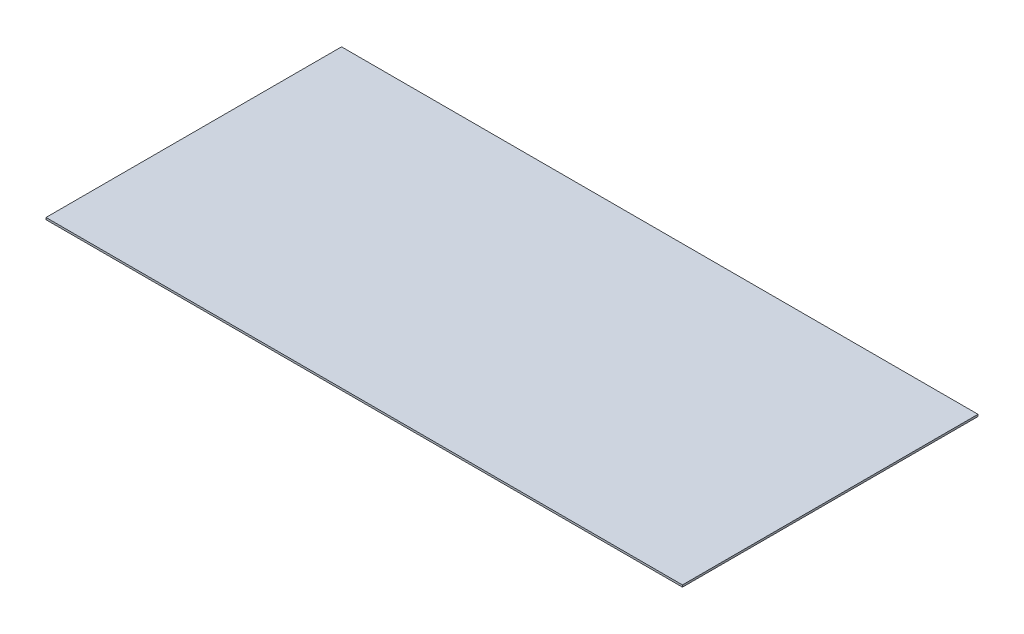
ISO-10303-21;
HEADER;
FILE_DESCRIPTION(('STEP AP214'),'2;1');
FILE_NAME('part.step','',(''),(''),'','','');
FILE_SCHEMA(('AUTOMOTIVE_DESIGN { 1 0 10303 214 1 1 1 1 }'));
ENDSEC;
DATA;
#1=APPLICATION_CONTEXT('core data for automotive mechanical design processes');
#2=APPLICATION_PROTOCOL_DEFINITION('international standard','automotive_design',2000,#1);
#3=PRODUCT_CONTEXT('',#1,'mechanical');
#4=PRODUCT('Part','Part','',(#3));
#5=PRODUCT_RELATED_PRODUCT_CATEGORY('part','',(#4));
#6=PRODUCT_DEFINITION_FORMATION('','',#4);
#7=PRODUCT_DEFINITION_CONTEXT('part definition',#1,'design');
#8=PRODUCT_DEFINITION('design','',#6,#7);
#9=PRODUCT_DEFINITION_SHAPE('','',#8);
#10=(LENGTH_UNIT() NAMED_UNIT(*) SI_UNIT(.MILLI.,.METRE.));
#11=(NAMED_UNIT(*) PLANE_ANGLE_UNIT() SI_UNIT($,.RADIAN.));
#12=(NAMED_UNIT(*) SI_UNIT($,.STERADIAN.) SOLID_ANGLE_UNIT());
#13=UNCERTAINTY_MEASURE_WITH_UNIT(LENGTH_MEASURE(1.E-05),#10,'distance_accuracy_value','');
#14=(GEOMETRIC_REPRESENTATION_CONTEXT(3) GLOBAL_UNCERTAINTY_ASSIGNED_CONTEXT((#13)) GLOBAL_UNIT_ASSIGNED_CONTEXT((#10,
#11,#12)) REPRESENTATION_CONTEXT('',''));
#15=CARTESIAN_POINT('',(0.,0.,0.));
#16=DIRECTION('',(0.,0.,1.));
#17=DIRECTION('',(1.,0.,0.));
#18=AXIS2_PLACEMENT_3D('',#15,#16,#17);
#19=CARTESIAN_POINT('',(0.,-2.5,0.));
#20=DIRECTION('',(0.,-1.,0.));
#21=DIRECTION('',(0.,0.,-1.));
#22=AXIS2_PLACEMENT_3D('',#19,#20,#21);
#23=PLANE('',#22);
#24=DIRECTION('',(0.,0.,-1.));
#25=VECTOR('',#24,1.);
#26=CARTESIAN_POINT('',(806.100000000001,-2.49999999999995,374.299999999981));
#27=LINE('',#26,#25);
#28=CARTESIAN_POINT('',(806.100000000001,-2.49999999999995,374.299999999981));
#29=VERTEX_POINT('',#28);
#30=CARTESIAN_POINT('',(806.100000000001,-2.49999999999995,-374.299999999964));
#31=VERTEX_POINT('',#30);
#32=EDGE_CURVE('E95',#29,#31,#27,.T.);
#33=ORIENTED_EDGE('',*,*,#32,.F.);
#34=DIRECTION('',(1.,0.,0.));
#35=VECTOR('',#34,1.);
#36=CARTESIAN_POINT('',(806.100000000001,-2.49999999999995,374.299999999981));
#37=LINE('',#36,#35);
#38=CARTESIAN_POINT('',(-806.099999999999,-2.49999999999995,374.299999999981));
#39=VERTEX_POINT('',#38);
#40=EDGE_CURVE('E87',#39,#29,#37,.T.);
#41=ORIENTED_EDGE('',*,*,#40,.F.);
#42=DIRECTION('',(0.,0.,1.));
#43=VECTOR('',#42,1.);
#44=CARTESIAN_POINT('',(-806.099999999999,-2.49999999999995,374.299999999981));
#45=LINE('',#44,#43);
#46=CARTESIAN_POINT('',(-806.099999999999,-2.49999999999995,-374.299999999964));
#47=VERTEX_POINT('',#46);
#48=EDGE_CURVE('E73',#47,#39,#45,.T.);
#49=ORIENTED_EDGE('',*,*,#48,.F.);
#50=DIRECTION('',(-1.,0.,0.));
#51=VECTOR('',#50,1.);
#52=CARTESIAN_POINT('',(806.100000000001,-2.49999999999995,-374.299999999964));
#53=LINE('',#52,#51);
#54=EDGE_CURVE('E84',#31,#47,#53,.T.);
#55=ORIENTED_EDGE('',*,*,#54,.F.);
#56=EDGE_LOOP('',(#33,#41,#49,#55));
#57=FACE_BOUND('',#56,.T.);
#58=ADVANCED_FACE('F33',(#57),#23,.T.);
#59=CARTESIAN_POINT('',(806.100000000001,1780.02378324452,374.299999999981));
#60=DIRECTION('',(-1.,0.,0.));
#61=DIRECTION('',(0.,0.,1.));
#62=AXIS2_PLACEMENT_3D('',#59,#60,#61);
#63=PLANE('',#62);
#64=DIRECTION('',(0.,-1.,0.));
#65=VECTOR('',#64,1.);
#66=CARTESIAN_POINT('',(806.100000000001,1780.02378324452,-374.299999999964));
#67=LINE('',#66,#65);
#68=CARTESIAN_POINT('',(806.100000000001,2.49999999999995,-374.299999999964));
#69=VERTEX_POINT('',#68);
#70=EDGE_CURVE('E90',#69,#31,#67,.T.);
#71=ORIENTED_EDGE('',*,*,#70,.F.);
#72=DIRECTION('',(0.,0.,1.));
#73=VECTOR('',#72,1.);
#74=CARTESIAN_POINT('',(806.100000000001,2.49999999999995,374.299999999981));
#75=LINE('',#74,#73);
#76=CARTESIAN_POINT('',(806.100000000001,2.49999999999995,374.299999999981));
#77=VERTEX_POINT('',#76);
#78=EDGE_CURVE('E49',#69,#77,#75,.T.);
#79=ORIENTED_EDGE('',*,*,#78,.T.);
#80=DIRECTION('',(0.,-1.,0.));
#81=VECTOR('',#80,1.);
#82=CARTESIAN_POINT('',(806.100000000001,1780.02378324452,374.299999999981));
#83=LINE('',#82,#81);
#84=EDGE_CURVE('E92',#77,#29,#83,.T.);
#85=ORIENTED_EDGE('',*,*,#84,.T.);
#86=ORIENTED_EDGE('',*,*,#32,.T.);
#87=EDGE_LOOP('',(#71,#79,#85,#86));
#88=FACE_BOUND('',#87,.T.);
#89=ADVANCED_FACE('F107',(#88),#63,.F.);
#90=CARTESIAN_POINT('',(806.100000000001,1780.02378324452,-374.299999999964));
#91=DIRECTION('',(0.,0.,1.));
#92=DIRECTION('',(1.,0.,0.));
#93=AXIS2_PLACEMENT_3D('',#90,#91,#92);
#94=PLANE('',#93);
#95=DIRECTION('',(0.,-1.,0.));
#96=VECTOR('',#95,1.);
#97=CARTESIAN_POINT('',(-806.099999999999,1780.02378324452,-374.299999999964));
#98=LINE('',#97,#96);
#99=CARTESIAN_POINT('',(-806.099999999999,2.49999999999995,-374.299999999964));
#100=VERTEX_POINT('',#99);
#101=EDGE_CURVE('E69',#100,#47,#98,.T.);
#102=ORIENTED_EDGE('',*,*,#101,.F.);
#103=DIRECTION('',(1.,0.,0.));
#104=VECTOR('',#103,1.);
#105=CARTESIAN_POINT('',(806.100000000001,2.49999999999995,-374.299999999964));
#106=LINE('',#105,#104);
#107=EDGE_CURVE('E98',#100,#69,#106,.T.);
#108=ORIENTED_EDGE('',*,*,#107,.T.);
#109=ORIENTED_EDGE('',*,*,#70,.T.);
#110=ORIENTED_EDGE('',*,*,#54,.T.);
#111=EDGE_LOOP('',(#102,#108,#109,#110));
#112=FACE_BOUND('',#111,.T.);
#113=ADVANCED_FACE('F89',(#112),#94,.F.);
#114=CARTESIAN_POINT('',(-806.099999999999,1780.02378324452,374.299999999981));
#115=DIRECTION('',(1.,0.,0.));
#116=DIRECTION('',(0.,0.,-1.));
#117=AXIS2_PLACEMENT_3D('',#114,#115,#116);
#118=PLANE('',#117);
#119=DIRECTION('',(0.,-1.,0.));
#120=VECTOR('',#119,1.);
#121=CARTESIAN_POINT('',(-806.099999999999,1780.02378324452,374.299999999981));
#122=LINE('',#121,#120);
#123=CARTESIAN_POINT('',(-806.099999999999,2.49999999999995,374.299999999981));
#124=VERTEX_POINT('',#123);
#125=EDGE_CURVE('E11',#124,#39,#122,.T.);
#126=ORIENTED_EDGE('',*,*,#125,.F.);
#127=DIRECTION('',(0.,0.,-1.));
#128=VECTOR('',#127,1.);
#129=CARTESIAN_POINT('',(-806.099999999999,2.49999999999995,374.299999999981));
#130=LINE('',#129,#128);
#131=EDGE_CURVE('E75',#124,#100,#130,.T.);
#132=ORIENTED_EDGE('',*,*,#131,.T.);
#133=ORIENTED_EDGE('',*,*,#101,.T.);
#134=ORIENTED_EDGE('',*,*,#48,.T.);
#135=EDGE_LOOP('',(#126,#132,#133,#134));
#136=FACE_BOUND('',#135,.T.);
#137=ADVANCED_FACE('F72',(#136),#118,.F.);
#138=CARTESIAN_POINT('',(806.100000000001,1780.02378324452,374.299999999981));
#139=DIRECTION('',(0.,0.,-1.));
#140=DIRECTION('',(-1.,0.,0.));
#141=AXIS2_PLACEMENT_3D('',#138,#139,#140);
#142=PLANE('',#141);
#143=ORIENTED_EDGE('',*,*,#84,.F.);
#144=DIRECTION('',(-1.,0.,0.));
#145=VECTOR('',#144,1.);
#146=CARTESIAN_POINT('',(806.100000000001,2.49999999999995,374.299999999981));
#147=LINE('',#146,#145);
#148=EDGE_CURVE('E36',#77,#124,#147,.T.);
#149=ORIENTED_EDGE('',*,*,#148,.T.);
#150=ORIENTED_EDGE('',*,*,#125,.T.);
#151=ORIENTED_EDGE('',*,*,#40,.T.);
#152=EDGE_LOOP('',(#143,#149,#150,#151));
#153=FACE_BOUND('',#152,.T.);
#154=ADVANCED_FACE('F105',(#153),#142,.F.);
#155=CARTESIAN_POINT('',(0.,2.5,0.));
#156=DIRECTION('',(0.,-1.,0.));
#157=DIRECTION('',(0.,0.,-1.));
#158=AXIS2_PLACEMENT_3D('',#155,#156,#157);
#159=PLANE('',#158);
#160=ORIENTED_EDGE('',*,*,#107,.F.);
#161=ORIENTED_EDGE('',*,*,#131,.F.);
#162=ORIENTED_EDGE('',*,*,#148,.F.);
#163=ORIENTED_EDGE('',*,*,#78,.F.);
#164=EDGE_LOOP('',(#160,#161,#162,#163));
#165=FACE_BOUND('',#164,.T.);
#166=ADVANCED_FACE('F101',(#165),#159,.F.);
#167=CLOSED_SHELL('',(#58,#89,#113,#137,#154,#166));
#168=MANIFOLD_SOLID_BREP('B2',#167);
#169=ADVANCED_BREP_SHAPE_REPRESENTATION('',(#18,#168),#14);
#170=SHAPE_DEFINITION_REPRESENTATION(#9,#169);
ENDSEC;
END-ISO-10303-21;
